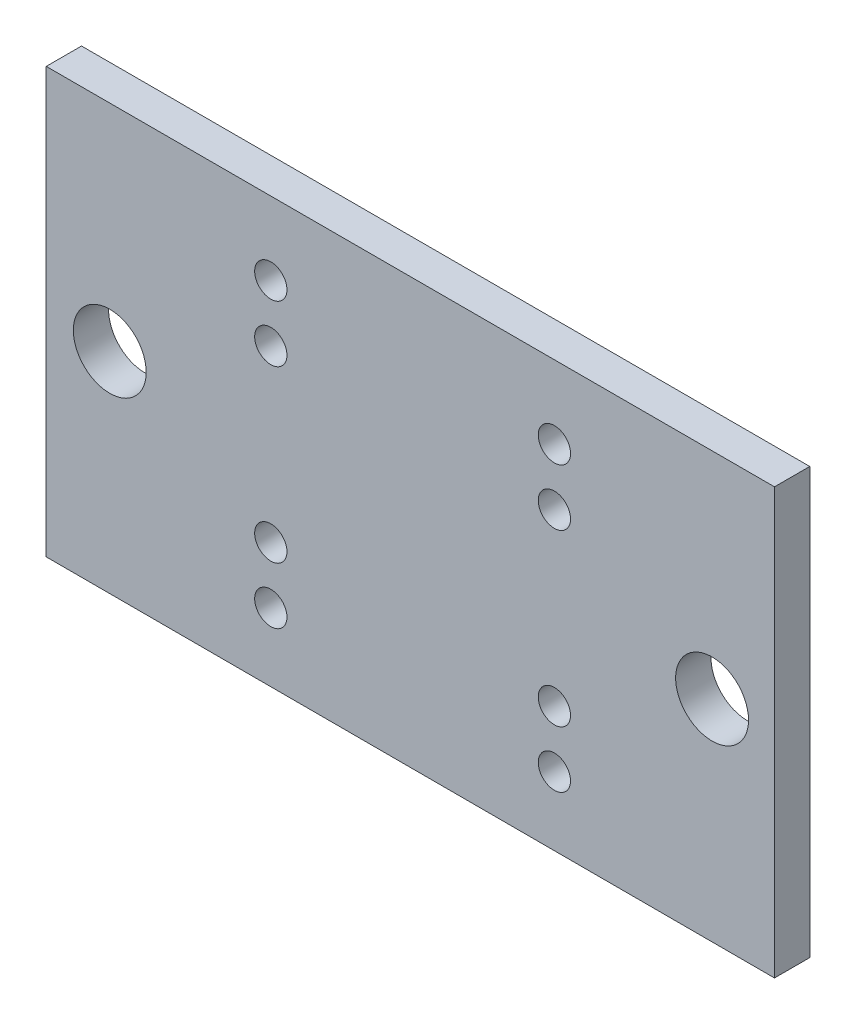
ISO-10303-21;
HEADER;
FILE_DESCRIPTION(('STEP AP214'),'2;1');
FILE_NAME('part.step','',(''),(''),'','','');
FILE_SCHEMA(('AUTOMOTIVE_DESIGN { 1 0 10303 214 1 1 1 1 }'));
ENDSEC;
DATA;
#1=APPLICATION_CONTEXT('core data for automotive mechanical design processes');
#2=APPLICATION_PROTOCOL_DEFINITION('international standard','automotive_design',2000,#1);
#3=PRODUCT_CONTEXT('',#1,'mechanical');
#4=PRODUCT('Part','Part','',(#3));
#5=PRODUCT_RELATED_PRODUCT_CATEGORY('part','',(#4));
#6=PRODUCT_DEFINITION_FORMATION('','',#4);
#7=PRODUCT_DEFINITION_CONTEXT('part definition',#1,'design');
#8=PRODUCT_DEFINITION('design','',#6,#7);
#9=PRODUCT_DEFINITION_SHAPE('','',#8);
#10=(LENGTH_UNIT() NAMED_UNIT(*) SI_UNIT(.MILLI.,.METRE.));
#11=(NAMED_UNIT(*) PLANE_ANGLE_UNIT() SI_UNIT($,.RADIAN.));
#12=(NAMED_UNIT(*) SI_UNIT($,.STERADIAN.) SOLID_ANGLE_UNIT());
#13=UNCERTAINTY_MEASURE_WITH_UNIT(LENGTH_MEASURE(1.E-05),#10,'distance_accuracy_value','');
#14=(GEOMETRIC_REPRESENTATION_CONTEXT(3) GLOBAL_UNCERTAINTY_ASSIGNED_CONTEXT((#13)) GLOBAL_UNIT_ASSIGNED_CONTEXT((#10,
#11,#12)) REPRESENTATION_CONTEXT('',''));
#15=CARTESIAN_POINT('',(0.,0.,0.));
#16=DIRECTION('',(0.,0.,1.));
#17=DIRECTION('',(1.,0.,0.));
#18=AXIS2_PLACEMENT_3D('',#15,#16,#17);
#19=CARTESIAN_POINT('',(32.4612,-77.9018,0.));
#20=DIRECTION('',(-0.000778815963179346,-0.999999696722802,0.));
#21=DIRECTION('',(-0.999999696722802,0.000778815963179346,0.));
#22=AXIS2_PLACEMENT_3D('',#19,#20,#21);
#23=PLANE('',#22);
#24=DIRECTION('',(0.,0.,1.));
#25=VECTOR('',#24,1.);
#26=CARTESIAN_POINT('',(32.4612,-77.9018,0.));
#27=LINE('',#26,#25);
#28=CARTESIAN_POINT('',(32.4612,-77.9018,0.));
#29=VERTEX_POINT('',#28);
#30=CARTESIAN_POINT('',(32.4612,-77.9018,1.58));
#31=VERTEX_POINT('',#30);
#32=EDGE_CURVE('E11',#29,#31,#27,.T.);
#33=ORIENTED_EDGE('',*,*,#32,.T.);
#34=DIRECTION('',(-0.999999696722802,0.000778815963179346,0.));
#35=VECTOR('',#34,1.);
#36=CARTESIAN_POINT('',(32.4612,-77.9018,1.58));
#37=LINE('',#36,#35);
#38=CARTESIAN_POINT('',(-0.1524,-77.8764,1.58));
#39=VERTEX_POINT('',#38);
#40=EDGE_CURVE('E28',#31,#39,#37,.T.);
#41=ORIENTED_EDGE('',*,*,#40,.T.);
#42=DIRECTION('',(0.,0.,1.));
#43=VECTOR('',#42,1.);
#44=CARTESIAN_POINT('',(-0.1524,-77.8764,0.));
#45=LINE('',#44,#43);
#46=CARTESIAN_POINT('',(-0.1524,-77.8764,0.));
#47=VERTEX_POINT('',#46);
#48=EDGE_CURVE('E261',#47,#39,#45,.T.);
#49=ORIENTED_EDGE('',*,*,#48,.F.);
#50=DIRECTION('',(-0.999999696722802,0.000778815963179346,0.));
#51=VECTOR('',#50,1.);
#52=CARTESIAN_POINT('',(32.4612,-77.9018,0.));
#53=LINE('',#52,#51);
#54=EDGE_CURVE('E262',#29,#47,#53,.T.);
#55=ORIENTED_EDGE('',*,*,#54,.F.);
#56=EDGE_LOOP('',(#33,#41,#49,#55));
#57=FACE_BOUND('',#56,.T.);
#58=ADVANCED_FACE('F17',(#57),#23,.T.);
#59=CARTESIAN_POINT('',(32.4612,-58.8518,0.));
#60=DIRECTION('',(1.,0.,0.));
#61=DIRECTION('',(0.,1.,0.));
#62=AXIS2_PLACEMENT_3D('',#59,#60,#61);
#63=PLANE('',#62);
#64=DIRECTION('',(0.,0.,1.));
#65=VECTOR('',#64,1.);
#66=CARTESIAN_POINT('',(32.4612,-58.8518,0.));
#67=LINE('',#66,#65);
#68=CARTESIAN_POINT('',(32.4612,-58.8518,0.));
#69=VERTEX_POINT('',#68);
#70=CARTESIAN_POINT('',(32.4612,-58.8518,1.58));
#71=VERTEX_POINT('',#70);
#72=EDGE_CURVE('E165',#69,#71,#67,.T.);
#73=ORIENTED_EDGE('',*,*,#72,.T.);
#74=DIRECTION('',(0.,-1.,0.));
#75=VECTOR('',#74,1.);
#76=CARTESIAN_POINT('',(32.4612,-58.8518,1.58));
#77=LINE('',#76,#75);
#78=EDGE_CURVE('E163',#71,#31,#77,.T.);
#79=ORIENTED_EDGE('',*,*,#78,.T.);
#80=ORIENTED_EDGE('',*,*,#32,.F.);
#81=DIRECTION('',(0.,-1.,0.));
#82=VECTOR('',#81,1.);
#83=CARTESIAN_POINT('',(32.4612,-58.8518,0.));
#84=LINE('',#83,#82);
#85=EDGE_CURVE('E222',#69,#29,#84,.T.);
#86=ORIENTED_EDGE('',*,*,#85,.F.);
#87=EDGE_LOOP('',(#73,#79,#80,#86));
#88=FACE_BOUND('',#87,.T.);
#89=ADVANCED_FACE('F306',(#88),#63,.T.);
#90=CARTESIAN_POINT('',(-0.1524,-77.8764,0.));
#91=DIRECTION('',(-1.,0.,0.));
#92=DIRECTION('',(0.,0.,1.));
#93=AXIS2_PLACEMENT_3D('',#90,#91,#92);
#94=PLANE('',#93);
#95=ORIENTED_EDGE('',*,*,#48,.T.);
#96=DIRECTION('',(0.,1.,0.));
#97=VECTOR('',#96,1.);
#98=CARTESIAN_POINT('',(-0.1524,-77.8764,1.58));
#99=LINE('',#98,#97);
#100=CARTESIAN_POINT('',(-0.1524,-58.8518,1.58));
#101=VERTEX_POINT('',#100);
#102=EDGE_CURVE('E257',#39,#101,#99,.T.);
#103=ORIENTED_EDGE('',*,*,#102,.T.);
#104=DIRECTION('',(0.,0.,1.));
#105=VECTOR('',#104,1.);
#106=CARTESIAN_POINT('',(-0.1524,-58.8518,0.));
#107=LINE('',#106,#105);
#108=CARTESIAN_POINT('',(-0.1524,-58.8518,0.));
#109=VERTEX_POINT('',#108);
#110=EDGE_CURVE('E207',#109,#101,#107,.T.);
#111=ORIENTED_EDGE('',*,*,#110,.F.);
#112=DIRECTION('',(0.,1.,0.));
#113=VECTOR('',#112,1.);
#114=CARTESIAN_POINT('',(-0.1524,-77.8764,0.));
#115=LINE('',#114,#113);
#116=EDGE_CURVE('E243',#47,#109,#115,.T.);
#117=ORIENTED_EDGE('',*,*,#116,.F.);
#118=EDGE_LOOP('',(#95,#103,#111,#117));
#119=FACE_BOUND('',#118,.T.);
#120=ADVANCED_FACE('F311',(#119),#94,.T.);
#121=CARTESIAN_POINT('',(16.158409539818,-68.37045247274,0.));
#122=DIRECTION('',(0.,0.,-1.));
#123=DIRECTION('',(0.,-1.,0.));
#124=AXIS2_PLACEMENT_3D('',#121,#122,#123);
#125=PLANE('',#124);
#126=ORIENTED_EDGE('',*,*,#54,.T.);
#127=ORIENTED_EDGE('',*,*,#116,.T.);
#128=DIRECTION('',(1.,0.,0.));
#129=VECTOR('',#128,1.);
#130=CARTESIAN_POINT('',(-0.1524,-58.8518,0.));
#131=LINE('',#130,#129);
#132=EDGE_CURVE('E226',#109,#69,#131,.T.);
#133=ORIENTED_EDGE('',*,*,#132,.T.);
#134=ORIENTED_EDGE('',*,*,#85,.T.);
#135=EDGE_LOOP('',(#126,#127,#133,#134));
#136=FACE_BOUND('',#135,.T.);
#137=CARTESIAN_POINT('',(22.6046,-74.827,0.));
#138=DIRECTION('',(0.,0.,1.));
#139=DIRECTION('',(1.,0.,0.));
#140=AXIS2_PLACEMENT_3D('',#137,#138,#139);
#141=CIRCLE('',#140,0.7239);
#142=CARTESIAN_POINT('',(23.3285,-74.827,0.));
#143=VERTEX_POINT('',#142);
#144=EDGE_CURVE('E183',#143,#143,#141,.T.);
#145=ORIENTED_EDGE('',*,*,#144,.T.);
#146=EDGE_LOOP('',(#145));
#147=FACE_BOUND('',#146,.T.);
#148=CARTESIAN_POINT('',(22.6046,-72.287,0.));
#149=DIRECTION('',(0.,0.,1.));
#150=DIRECTION('',(1.,0.,0.));
#151=AXIS2_PLACEMENT_3D('',#148,#149,#150);
#152=CIRCLE('',#151,0.7239);
#153=CARTESIAN_POINT('',(23.3285,-72.287,0.));
#154=VERTEX_POINT('',#153);
#155=EDGE_CURVE('E179',#154,#154,#152,.T.);
#156=ORIENTED_EDGE('',*,*,#155,.T.);
#157=EDGE_LOOP('',(#156));
#158=FACE_BOUND('',#157,.T.);
#159=CARTESIAN_POINT('',(29.6672,-68.4784,0.));
#160=DIRECTION('',(0.,0.,1.));
#161=DIRECTION('',(1.,0.,0.));
#162=AXIS2_PLACEMENT_3D('',#159,#160,#161);
#163=CIRCLE('',#162,1.63195);
#164=CARTESIAN_POINT('',(31.29915,-68.4784,0.));
#165=VERTEX_POINT('',#164);
#166=EDGE_CURVE('E184',#165,#165,#163,.T.);
#167=ORIENTED_EDGE('',*,*,#166,.T.);
#168=EDGE_LOOP('',(#167));
#169=FACE_BOUND('',#168,.T.);
#170=CARTESIAN_POINT('',(9.9046,-74.827,0.));
#171=DIRECTION('',(0.,0.,1.));
#172=DIRECTION('',(1.,0.,0.));
#173=AXIS2_PLACEMENT_3D('',#170,#171,#172);
#174=CIRCLE('',#173,0.7239);
#175=CARTESIAN_POINT('',(10.6285,-74.827,0.));
#176=VERTEX_POINT('',#175);
#177=EDGE_CURVE('E155',#176,#176,#174,.T.);
#178=ORIENTED_EDGE('',*,*,#177,.T.);
#179=EDGE_LOOP('',(#178));
#180=FACE_BOUND('',#179,.T.);
#181=CARTESIAN_POINT('',(9.9046,-72.287,0.));
#182=DIRECTION('',(0.,0.,1.));
#183=DIRECTION('',(1.,0.,0.));
#184=AXIS2_PLACEMENT_3D('',#181,#182,#183);
#185=CIRCLE('',#184,0.7239);
#186=CARTESIAN_POINT('',(10.6285,-72.287,0.));
#187=VERTEX_POINT('',#186);
#188=EDGE_CURVE('E147',#187,#187,#185,.T.);
#189=ORIENTED_EDGE('',*,*,#188,.T.);
#190=EDGE_LOOP('',(#189));
#191=FACE_BOUND('',#190,.T.);
#192=CARTESIAN_POINT('',(2.6924,-68.4784,0.));
#193=DIRECTION('',(0.,0.,1.));
#194=DIRECTION('',(1.,0.,0.));
#195=AXIS2_PLACEMENT_3D('',#192,#193,#194);
#196=CIRCLE('',#195,1.63195);
#197=CARTESIAN_POINT('',(4.32435,-68.4784,0.));
#198=VERTEX_POINT('',#197);
#199=EDGE_CURVE('E141',#198,#198,#196,.T.);
#200=ORIENTED_EDGE('',*,*,#199,.T.);
#201=EDGE_LOOP('',(#200));
#202=FACE_BOUND('',#201,.T.);
#203=CARTESIAN_POINT('',(22.6046,-64.667,0.));
#204=DIRECTION('',(0.,0.,1.));
#205=DIRECTION('',(1.,0.,0.));
#206=AXIS2_PLACEMENT_3D('',#203,#204,#205);
#207=CIRCLE('',#206,0.7239);
#208=CARTESIAN_POINT('',(23.3285,-64.667,0.));
#209=VERTEX_POINT('',#208);
#210=EDGE_CURVE('E148',#209,#209,#207,.T.);
#211=ORIENTED_EDGE('',*,*,#210,.T.);
#212=EDGE_LOOP('',(#211));
#213=FACE_BOUND('',#212,.T.);
#214=CARTESIAN_POINT('',(22.6046,-62.127,0.));
#215=DIRECTION('',(0.,0.,1.));
#216=DIRECTION('',(1.,0.,0.));
#217=AXIS2_PLACEMENT_3D('',#214,#215,#216);
#218=CIRCLE('',#217,0.7239);
#219=CARTESIAN_POINT('',(23.3285,-62.127,0.));
#220=VERTEX_POINT('',#219);
#221=EDGE_CURVE('E159',#220,#220,#218,.T.);
#222=ORIENTED_EDGE('',*,*,#221,.T.);
#223=EDGE_LOOP('',(#222));
#224=FACE_BOUND('',#223,.T.);
#225=CARTESIAN_POINT('',(9.9046,-64.667,0.));
#226=DIRECTION('',(0.,0.,1.));
#227=DIRECTION('',(1.,0.,0.));
#228=AXIS2_PLACEMENT_3D('',#225,#226,#227);
#229=CIRCLE('',#228,0.7239);
#230=CARTESIAN_POINT('',(10.6285,-64.667,0.));
#231=VERTEX_POINT('',#230);
#232=EDGE_CURVE('E206',#231,#231,#229,.T.);
#233=ORIENTED_EDGE('',*,*,#232,.T.);
#234=EDGE_LOOP('',(#233));
#235=FACE_BOUND('',#234,.T.);
#236=CARTESIAN_POINT('',(9.9046,-62.127,0.));
#237=DIRECTION('',(0.,0.,1.));
#238=DIRECTION('',(1.,0.,0.));
#239=AXIS2_PLACEMENT_3D('',#236,#237,#238);
#240=CIRCLE('',#239,0.7239);
#241=CARTESIAN_POINT('',(10.6285,-62.127,0.));
#242=VERTEX_POINT('',#241);
#243=EDGE_CURVE('E202',#242,#242,#240,.T.);
#244=ORIENTED_EDGE('',*,*,#243,.T.);
#245=EDGE_LOOP('',(#244));
#246=FACE_BOUND('',#245,.T.);
#247=ADVANCED_FACE('F295',(#136,#147,#158,#169,#180,#191,#202,#213,#224,#235,#246),#125,.T.);
#248=CARTESIAN_POINT('',(16.158409539818,-68.37045247274,1.58));
#249=DIRECTION('',(0.,0.,-1.));
#250=DIRECTION('',(0.,-1.,0.));
#251=AXIS2_PLACEMENT_3D('',#248,#249,#250);
#252=PLANE('',#251);
#253=ORIENTED_EDGE('',*,*,#78,.F.);
#254=DIRECTION('',(1.,0.,0.));
#255=VECTOR('',#254,1.);
#256=CARTESIAN_POINT('',(-0.1524,-58.8518,1.58));
#257=LINE('',#256,#255);
#258=EDGE_CURVE('E189',#101,#71,#257,.T.);
#259=ORIENTED_EDGE('',*,*,#258,.F.);
#260=ORIENTED_EDGE('',*,*,#102,.F.);
#261=ORIENTED_EDGE('',*,*,#40,.F.);
#262=EDGE_LOOP('',(#253,#259,#260,#261));
#263=FACE_BOUND('',#262,.T.);
#264=CARTESIAN_POINT('',(22.6046,-74.827,1.58));
#265=DIRECTION('',(0.,0.,1.));
#266=DIRECTION('',(1.,0.,0.));
#267=AXIS2_PLACEMENT_3D('',#264,#265,#266);
#268=CIRCLE('',#267,0.7239);
#269=CARTESIAN_POINT('',(23.3285,-74.827,1.58));
#270=VERTEX_POINT('',#269);
#271=EDGE_CURVE('E190',#270,#270,#268,.T.);
#272=ORIENTED_EDGE('',*,*,#271,.F.);
#273=EDGE_LOOP('',(#272));
#274=FACE_BOUND('',#273,.T.);
#275=CARTESIAN_POINT('',(22.6046,-72.287,1.58));
#276=DIRECTION('',(0.,0.,1.));
#277=DIRECTION('',(1.,0.,0.));
#278=AXIS2_PLACEMENT_3D('',#275,#276,#277);
#279=CIRCLE('',#278,0.7239);
#280=CARTESIAN_POINT('',(23.3285,-72.287,1.58));
#281=VERTEX_POINT('',#280);
#282=EDGE_CURVE('E195',#281,#281,#279,.T.);
#283=ORIENTED_EDGE('',*,*,#282,.F.);
#284=EDGE_LOOP('',(#283));
#285=FACE_BOUND('',#284,.T.);
#286=CARTESIAN_POINT('',(29.6672,-68.4784,1.58));
#287=DIRECTION('',(0.,0.,1.));
#288=DIRECTION('',(1.,0.,0.));
#289=AXIS2_PLACEMENT_3D('',#286,#287,#288);
#290=CIRCLE('',#289,1.63195);
#291=CARTESIAN_POINT('',(31.29915,-68.4784,1.58));
#292=VERTEX_POINT('',#291);
#293=EDGE_CURVE('E196',#292,#292,#290,.T.);
#294=ORIENTED_EDGE('',*,*,#293,.F.);
#295=EDGE_LOOP('',(#294));
#296=FACE_BOUND('',#295,.T.);
#297=CARTESIAN_POINT('',(9.9046,-74.827,1.58));
#298=DIRECTION('',(0.,0.,1.));
#299=DIRECTION('',(1.,0.,0.));
#300=AXIS2_PLACEMENT_3D('',#297,#298,#299);
#301=CIRCLE('',#300,0.7239);
#302=CARTESIAN_POINT('',(10.6285,-74.827,1.58));
#303=VERTEX_POINT('',#302);
#304=EDGE_CURVE('E248',#303,#303,#301,.T.);
#305=ORIENTED_EDGE('',*,*,#304,.F.);
#306=EDGE_LOOP('',(#305));
#307=FACE_BOUND('',#306,.T.);
#308=CARTESIAN_POINT('',(9.9046,-72.287,1.58));
#309=DIRECTION('',(0.,0.,1.));
#310=DIRECTION('',(1.,0.,0.));
#311=AXIS2_PLACEMENT_3D('',#308,#309,#310);
#312=CIRCLE('',#311,0.7239);
#313=CARTESIAN_POINT('',(10.6285,-72.287,1.58));
#314=VERTEX_POINT('',#313);
#315=EDGE_CURVE('E197',#314,#314,#312,.T.);
#316=ORIENTED_EDGE('',*,*,#315,.F.);
#317=EDGE_LOOP('',(#316));
#318=FACE_BOUND('',#317,.T.);
#319=CARTESIAN_POINT('',(2.6924,-68.4784,1.58));
#320=DIRECTION('',(0.,0.,1.));
#321=DIRECTION('',(1.,0.,0.));
#322=AXIS2_PLACEMENT_3D('',#319,#320,#321);
#323=CIRCLE('',#322,1.63195);
#324=CARTESIAN_POINT('',(4.32435,-68.4784,1.58));
#325=VERTEX_POINT('',#324);
#326=EDGE_CURVE('E178',#325,#325,#323,.T.);
#327=ORIENTED_EDGE('',*,*,#326,.F.);
#328=EDGE_LOOP('',(#327));
#329=FACE_BOUND('',#328,.T.);
#330=CARTESIAN_POINT('',(22.6046,-64.667,1.58));
#331=DIRECTION('',(0.,0.,1.));
#332=DIRECTION('',(1.,0.,0.));
#333=AXIS2_PLACEMENT_3D('',#330,#331,#332);
#334=CIRCLE('',#333,0.7239);
#335=CARTESIAN_POINT('',(23.3285,-64.667,1.58));
#336=VERTEX_POINT('',#335);
#337=EDGE_CURVE('E21',#336,#336,#334,.T.);
#338=ORIENTED_EDGE('',*,*,#337,.F.);
#339=EDGE_LOOP('',(#338));
#340=FACE_BOUND('',#339,.T.);
#341=CARTESIAN_POINT('',(22.6046,-62.127,1.58));
#342=DIRECTION('',(0.,0.,1.));
#343=DIRECTION('',(1.,0.,0.));
#344=AXIS2_PLACEMENT_3D('',#341,#342,#343);
#345=CIRCLE('',#344,0.7239);
#346=CARTESIAN_POINT('',(23.3285,-62.127,1.58));
#347=VERTEX_POINT('',#346);
#348=EDGE_CURVE('E236',#347,#347,#345,.T.);
#349=ORIENTED_EDGE('',*,*,#348,.F.);
#350=EDGE_LOOP('',(#349));
#351=FACE_BOUND('',#350,.T.);
#352=CARTESIAN_POINT('',(9.9046,-64.667,1.58));
#353=DIRECTION('',(0.,0.,1.));
#354=DIRECTION('',(1.,0.,0.));
#355=AXIS2_PLACEMENT_3D('',#352,#353,#354);
#356=CIRCLE('',#355,0.7239);
#357=CARTESIAN_POINT('',(10.6285,-64.667,1.58));
#358=VERTEX_POINT('',#357);
#359=EDGE_CURVE('E168',#358,#358,#356,.T.);
#360=ORIENTED_EDGE('',*,*,#359,.F.);
#361=EDGE_LOOP('',(#360));
#362=FACE_BOUND('',#361,.T.);
#363=CARTESIAN_POINT('',(9.9046,-62.127,1.58));
#364=DIRECTION('',(0.,0.,1.));
#365=DIRECTION('',(1.,0.,0.));
#366=AXIS2_PLACEMENT_3D('',#363,#364,#365);
#367=CIRCLE('',#366,0.7239);
#368=CARTESIAN_POINT('',(10.6285,-62.127,1.58));
#369=VERTEX_POINT('',#368);
#370=EDGE_CURVE('E278',#369,#369,#367,.T.);
#371=ORIENTED_EDGE('',*,*,#370,.F.);
#372=EDGE_LOOP('',(#371));
#373=FACE_BOUND('',#372,.T.);
#374=ADVANCED_FACE('F312',(#263,#274,#285,#296,#307,#318,#329,#340,#351,#362,#373),#252,.F.);
#375=CARTESIAN_POINT('',(-0.1524,-58.8518,0.));
#376=DIRECTION('',(0.,1.,0.));
#377=DIRECTION('',(1.,0.,0.));
#378=AXIS2_PLACEMENT_3D('',#375,#376,#377);
#379=PLANE('',#378);
#380=ORIENTED_EDGE('',*,*,#110,.T.);
#381=ORIENTED_EDGE('',*,*,#258,.T.);
#382=ORIENTED_EDGE('',*,*,#72,.F.);
#383=ORIENTED_EDGE('',*,*,#132,.F.);
#384=EDGE_LOOP('',(#380,#381,#382,#383));
#385=FACE_BOUND('',#384,.T.);
#386=ADVANCED_FACE('F302',(#385),#379,.T.);
#387=CARTESIAN_POINT('',(22.6046,-74.827,-0.79));
#388=DIRECTION('',(0.,0.,1.));
#389=DIRECTION('',(1.,0.,0.));
#390=AXIS2_PLACEMENT_3D('',#387,#388,#389);
#391=CYLINDRICAL_SURFACE('',#390,0.7239);
#392=DIRECTION('',(0.,0.,1.));
#393=VECTOR('',#392,1.);
#394=CARTESIAN_POINT('',(23.3285,-74.827,-0.79));
#395=LINE('',#394,#393);
#396=EDGE_CURVE('E185',#143,#270,#395,.T.);
#397=ORIENTED_EDGE('',*,*,#396,.F.);
#398=ORIENTED_EDGE('',*,*,#144,.F.);
#399=ORIENTED_EDGE('',*,*,#396,.T.);
#400=ORIENTED_EDGE('',*,*,#271,.T.);
#401=EDGE_LOOP('',(#397,#398,#399,#400));
#402=FACE_BOUND('',#401,.T.);
#403=ADVANCED_FACE('F349',(#402),#391,.F.);
#404=CARTESIAN_POINT('',(22.6046,-72.287,-0.79));
#405=DIRECTION('',(0.,0.,1.));
#406=DIRECTION('',(1.,0.,0.));
#407=AXIS2_PLACEMENT_3D('',#404,#405,#406);
#408=CYLINDRICAL_SURFACE('',#407,0.7239);
#409=DIRECTION('',(0.,0.,1.));
#410=VECTOR('',#409,1.);
#411=CARTESIAN_POINT('',(23.3285,-72.287,-0.79));
#412=LINE('',#411,#410);
#413=EDGE_CURVE('E219',#154,#281,#412,.T.);
#414=ORIENTED_EDGE('',*,*,#413,.F.);
#415=ORIENTED_EDGE('',*,*,#155,.F.);
#416=ORIENTED_EDGE('',*,*,#413,.T.);
#417=ORIENTED_EDGE('',*,*,#282,.T.);
#418=EDGE_LOOP('',(#414,#415,#416,#417));
#419=FACE_BOUND('',#418,.T.);
#420=ADVANCED_FACE('F351',(#419),#408,.F.);
#421=CARTESIAN_POINT('',(29.6672,-68.4784,-0.79));
#422=DIRECTION('',(0.,0.,1.));
#423=DIRECTION('',(1.,0.,0.));
#424=AXIS2_PLACEMENT_3D('',#421,#422,#423);
#425=CYLINDRICAL_SURFACE('',#424,1.63195);
#426=DIRECTION('',(0.,0.,1.));
#427=VECTOR('',#426,1.);
#428=CARTESIAN_POINT('',(31.29915,-68.4784,-0.79));
#429=LINE('',#428,#427);
#430=EDGE_CURVE('E191',#165,#292,#429,.T.);
#431=ORIENTED_EDGE('',*,*,#430,.F.);
#432=ORIENTED_EDGE('',*,*,#166,.F.);
#433=ORIENTED_EDGE('',*,*,#430,.T.);
#434=ORIENTED_EDGE('',*,*,#293,.T.);
#435=EDGE_LOOP('',(#431,#432,#433,#434));
#436=FACE_BOUND('',#435,.T.);
#437=ADVANCED_FACE('F404',(#436),#425,.F.);
#438=CARTESIAN_POINT('',(9.9046,-74.827,-0.79));
#439=DIRECTION('',(0.,0.,1.));
#440=DIRECTION('',(1.,0.,0.));
#441=AXIS2_PLACEMENT_3D('',#438,#439,#440);
#442=CYLINDRICAL_SURFACE('',#441,0.7239);
#443=DIRECTION('',(0.,0.,1.));
#444=VECTOR('',#443,1.);
#445=CARTESIAN_POINT('',(10.6285,-74.827,-0.79));
#446=LINE('',#445,#444);
#447=EDGE_CURVE('E244',#176,#303,#446,.T.);
#448=ORIENTED_EDGE('',*,*,#447,.F.);
#449=ORIENTED_EDGE('',*,*,#177,.F.);
#450=ORIENTED_EDGE('',*,*,#447,.T.);
#451=ORIENTED_EDGE('',*,*,#304,.T.);
#452=EDGE_LOOP('',(#448,#449,#450,#451));
#453=FACE_BOUND('',#452,.T.);
#454=ADVANCED_FACE('F19',(#453),#442,.F.);
#455=CARTESIAN_POINT('',(9.9046,-72.287,-0.79));
#456=DIRECTION('',(0.,0.,1.));
#457=DIRECTION('',(1.,0.,0.));
#458=AXIS2_PLACEMENT_3D('',#455,#456,#457);
#459=CYLINDRICAL_SURFACE('',#458,0.7239);
#460=DIRECTION('',(0.,0.,1.));
#461=VECTOR('',#460,1.);
#462=CARTESIAN_POINT('',(10.6285,-72.287,-0.79));
#463=LINE('',#462,#461);
#464=EDGE_CURVE('E201',#187,#314,#463,.T.);
#465=ORIENTED_EDGE('',*,*,#464,.F.);
#466=ORIENTED_EDGE('',*,*,#188,.F.);
#467=ORIENTED_EDGE('',*,*,#464,.T.);
#468=ORIENTED_EDGE('',*,*,#315,.T.);
#469=EDGE_LOOP('',(#465,#466,#467,#468));
#470=FACE_BOUND('',#469,.T.);
#471=ADVANCED_FACE('F359',(#470),#459,.F.);
#472=CARTESIAN_POINT('',(2.6924,-68.4784,-0.79));
#473=DIRECTION('',(0.,0.,1.));
#474=DIRECTION('',(1.,0.,0.));
#475=AXIS2_PLACEMENT_3D('',#472,#473,#474);
#476=CYLINDRICAL_SURFACE('',#475,1.63195);
#477=DIRECTION('',(0.,0.,1.));
#478=VECTOR('',#477,1.);
#479=CARTESIAN_POINT('',(4.32435,-68.4784,-0.79));
#480=LINE('',#479,#478);
#481=EDGE_CURVE('E144',#198,#325,#480,.T.);
#482=ORIENTED_EDGE('',*,*,#481,.F.);
#483=ORIENTED_EDGE('',*,*,#199,.F.);
#484=ORIENTED_EDGE('',*,*,#481,.T.);
#485=ORIENTED_EDGE('',*,*,#326,.T.);
#486=EDGE_LOOP('',(#482,#483,#484,#485));
#487=FACE_BOUND('',#486,.T.);
#488=ADVANCED_FACE('F142',(#487),#476,.F.);
#489=CARTESIAN_POINT('',(22.6046,-64.667,-0.79));
#490=DIRECTION('',(0.,0.,1.));
#491=DIRECTION('',(1.,0.,0.));
#492=AXIS2_PLACEMENT_3D('',#489,#490,#491);
#493=CYLINDRICAL_SURFACE('',#492,0.7239);
#494=DIRECTION('',(0.,0.,1.));
#495=VECTOR('',#494,1.);
#496=CARTESIAN_POINT('',(23.3285,-64.667,-0.79));
#497=LINE('',#496,#495);
#498=EDGE_CURVE('E174',#209,#336,#497,.T.);
#499=ORIENTED_EDGE('',*,*,#498,.F.);
#500=ORIENTED_EDGE('',*,*,#210,.F.);
#501=ORIENTED_EDGE('',*,*,#498,.T.);
#502=ORIENTED_EDGE('',*,*,#337,.T.);
#503=EDGE_LOOP('',(#499,#500,#501,#502));
#504=FACE_BOUND('',#503,.T.);
#505=ADVANCED_FACE('F354',(#504),#493,.F.);
#506=CARTESIAN_POINT('',(22.6046,-62.127,-0.79));
#507=DIRECTION('',(0.,0.,1.));
#508=DIRECTION('',(1.,0.,0.));
#509=AXIS2_PLACEMENT_3D('',#506,#507,#508);
#510=CYLINDRICAL_SURFACE('',#509,0.7239);
#511=DIRECTION('',(0.,0.,1.));
#512=VECTOR('',#511,1.);
#513=CARTESIAN_POINT('',(23.3285,-62.127,-0.79));
#514=LINE('',#513,#512);
#515=EDGE_CURVE('E232',#220,#347,#514,.T.);
#516=ORIENTED_EDGE('',*,*,#515,.F.);
#517=ORIENTED_EDGE('',*,*,#221,.F.);
#518=ORIENTED_EDGE('',*,*,#515,.T.);
#519=ORIENTED_EDGE('',*,*,#348,.T.);
#520=EDGE_LOOP('',(#516,#517,#518,#519));
#521=FACE_BOUND('',#520,.T.);
#522=ADVANCED_FACE('F357',(#521),#510,.F.);
#523=CARTESIAN_POINT('',(9.9046,-64.667,-0.79));
#524=DIRECTION('',(0.,0.,1.));
#525=DIRECTION('',(1.,0.,0.));
#526=AXIS2_PLACEMENT_3D('',#523,#524,#525);
#527=CYLINDRICAL_SURFACE('',#526,0.7239);
#528=DIRECTION('',(0.,0.,1.));
#529=VECTOR('',#528,1.);
#530=CARTESIAN_POINT('',(10.6285,-64.667,-0.79));
#531=LINE('',#530,#529);
#532=EDGE_CURVE('E172',#231,#358,#531,.T.);
#533=ORIENTED_EDGE('',*,*,#532,.F.);
#534=ORIENTED_EDGE('',*,*,#232,.F.);
#535=ORIENTED_EDGE('',*,*,#532,.T.);
#536=ORIENTED_EDGE('',*,*,#359,.T.);
#537=EDGE_LOOP('',(#533,#534,#535,#536));
#538=FACE_BOUND('',#537,.T.);
#539=ADVANCED_FACE('F347',(#538),#527,.F.);
#540=CARTESIAN_POINT('',(9.9046,-62.127,-0.79));
#541=DIRECTION('',(0.,0.,1.));
#542=DIRECTION('',(1.,0.,0.));
#543=AXIS2_PLACEMENT_3D('',#540,#541,#542);
#544=CYLINDRICAL_SURFACE('',#543,0.7239);
#545=DIRECTION('',(0.,0.,1.));
#546=VECTOR('',#545,1.);
#547=CARTESIAN_POINT('',(10.6285,-62.127,-0.79));
#548=LINE('',#547,#546);
#549=EDGE_CURVE('E173',#242,#369,#548,.T.);
#550=ORIENTED_EDGE('',*,*,#549,.F.);
#551=ORIENTED_EDGE('',*,*,#243,.F.);
#552=ORIENTED_EDGE('',*,*,#549,.T.);
#553=ORIENTED_EDGE('',*,*,#370,.T.);
#554=EDGE_LOOP('',(#550,#551,#552,#553));
#555=FACE_BOUND('',#554,.T.);
#556=ADVANCED_FACE('F327',(#555),#544,.F.);
#557=CLOSED_SHELL('',(#58,#89,#120,#247,#374,#386,#403,#420,#437,#454,#471,#488,#505,#522,#539,#556));
#558=MANIFOLD_SOLID_BREP('B1',#557);
#559=ADVANCED_BREP_SHAPE_REPRESENTATION('',(#18,#558),#14);
#560=SHAPE_DEFINITION_REPRESENTATION(#9,#559);
ENDSEC;
END-ISO-10303-21;
